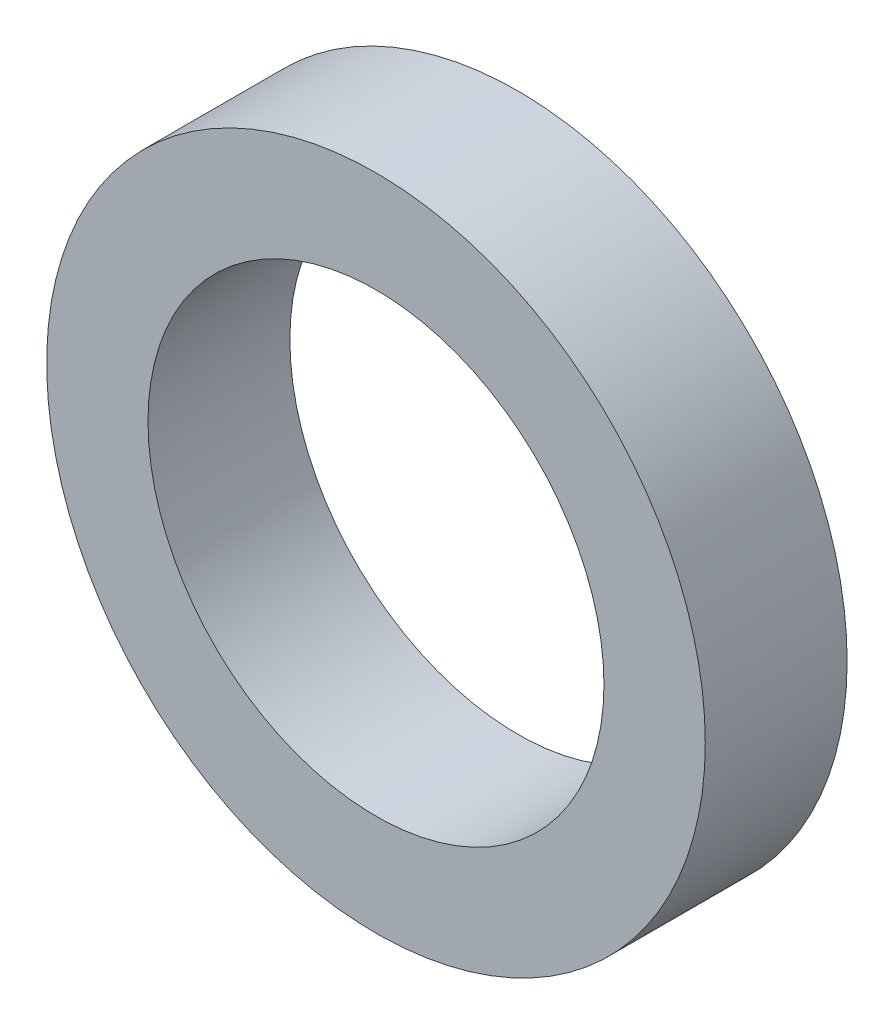
ISO-10303-21;
HEADER;
FILE_DESCRIPTION(('STEP AP214'),'2;1');
FILE_NAME('part.step','',(''),(''),'','','');
FILE_SCHEMA(('AUTOMOTIVE_DESIGN { 1 0 10303 214 1 1 1 1 }'));
ENDSEC;
DATA;
#1=APPLICATION_CONTEXT('core data for automotive mechanical design processes');
#2=APPLICATION_PROTOCOL_DEFINITION('international standard','automotive_design',2000,#1);
#3=PRODUCT_CONTEXT('',#1,'mechanical');
#4=PRODUCT('Part','Part','',(#3));
#5=PRODUCT_RELATED_PRODUCT_CATEGORY('part','',(#4));
#6=PRODUCT_DEFINITION_FORMATION('','',#4);
#7=PRODUCT_DEFINITION_CONTEXT('part definition',#1,'design');
#8=PRODUCT_DEFINITION('design','',#6,#7);
#9=PRODUCT_DEFINITION_SHAPE('','',#8);
#10=(LENGTH_UNIT() NAMED_UNIT(*) SI_UNIT(.MILLI.,.METRE.));
#11=(NAMED_UNIT(*) PLANE_ANGLE_UNIT() SI_UNIT($,.RADIAN.));
#12=(NAMED_UNIT(*) SI_UNIT($,.STERADIAN.) SOLID_ANGLE_UNIT());
#13=UNCERTAINTY_MEASURE_WITH_UNIT(LENGTH_MEASURE(1.E-05),#10,'distance_accuracy_value','');
#14=(GEOMETRIC_REPRESENTATION_CONTEXT(3) GLOBAL_UNCERTAINTY_ASSIGNED_CONTEXT((#13)) GLOBAL_UNIT_ASSIGNED_CONTEXT((#10,
#11,#12)) REPRESENTATION_CONTEXT('',''));
#15=CARTESIAN_POINT('',(0.,0.,0.));
#16=DIRECTION('',(0.,0.,1.));
#17=DIRECTION('',(1.,0.,0.));
#18=AXIS2_PLACEMENT_3D('',#15,#16,#17);
#19=CARTESIAN_POINT('',(0.,0.,14.));
#20=DIRECTION('',(0.,0.,1.));
#21=DIRECTION('',(1.,0.,0.));
#22=AXIS2_PLACEMENT_3D('',#19,#20,#21);
#23=PLANE('',#22);
#24=CARTESIAN_POINT('',(0.,0.,14.));
#25=DIRECTION('',(0.,0.,1.));
#26=DIRECTION('',(1.,0.,0.));
#27=AXIS2_PLACEMENT_3D('',#24,#25,#26);
#28=CIRCLE('',#27,32.5);
#29=CARTESIAN_POINT('',(32.5,0.,14.));
#30=VERTEX_POINT('',#29);
#31=EDGE_CURVE('E10',#30,#30,#28,.T.);
#32=ORIENTED_EDGE('',*,*,#31,.T.);
#33=EDGE_LOOP('',(#32));
#34=FACE_BOUND('',#33,.T.);
#35=CARTESIAN_POINT('',(0.,0.,14.));
#36=DIRECTION('',(0.,0.,1.));
#37=DIRECTION('',(1.,0.,0.));
#38=AXIS2_PLACEMENT_3D('',#35,#36,#37);
#39=CIRCLE('',#38,22.5);
#40=CARTESIAN_POINT('',(22.5,0.,14.));
#41=VERTEX_POINT('',#40);
#42=EDGE_CURVE('E57',#41,#41,#39,.T.);
#43=ORIENTED_EDGE('',*,*,#42,.F.);
#44=EDGE_LOOP('',(#43));
#45=FACE_BOUND('',#44,.T.);
#46=ADVANCED_FACE('F43',(#34,#45),#23,.T.);
#47=CARTESIAN_POINT('',(0.,0.,0.));
#48=DIRECTION('',(0.,0.,1.));
#49=DIRECTION('',(1.,0.,0.));
#50=AXIS2_PLACEMENT_3D('',#47,#48,#49);
#51=PLANE('',#50);
#52=CARTESIAN_POINT('',(0.,0.,0.));
#53=DIRECTION('',(0.,0.,1.));
#54=DIRECTION('',(1.,0.,0.));
#55=AXIS2_PLACEMENT_3D('',#52,#53,#54);
#56=CIRCLE('',#55,32.5);
#57=CARTESIAN_POINT('',(32.5,0.,0.));
#58=VERTEX_POINT('',#57);
#59=EDGE_CURVE('E50',#58,#58,#56,.T.);
#60=ORIENTED_EDGE('',*,*,#59,.F.);
#61=EDGE_LOOP('',(#60));
#62=FACE_BOUND('',#61,.T.);
#63=CARTESIAN_POINT('',(0.,0.,0.));
#64=DIRECTION('',(0.,0.,1.));
#65=DIRECTION('',(1.,0.,0.));
#66=AXIS2_PLACEMENT_3D('',#63,#64,#65);
#67=CIRCLE('',#66,22.5);
#68=CARTESIAN_POINT('',(22.5,0.,0.));
#69=VERTEX_POINT('',#68);
#70=EDGE_CURVE('E59',#69,#69,#67,.T.);
#71=ORIENTED_EDGE('',*,*,#70,.T.);
#72=EDGE_LOOP('',(#71));
#73=FACE_BOUND('',#72,.T.);
#74=ADVANCED_FACE('F68',(#62,#73),#51,.F.);
#75=CARTESIAN_POINT('',(0.,0.,14.));
#76=DIRECTION('',(0.,0.,-1.));
#77=DIRECTION('',(-1.,0.,0.));
#78=AXIS2_PLACEMENT_3D('',#75,#76,#77);
#79=CYLINDRICAL_SURFACE('',#78,32.5);
#80=ORIENTED_EDGE('',*,*,#31,.F.);
#81=EDGE_LOOP('',(#80));
#82=FACE_BOUND('',#81,.T.);
#83=ORIENTED_EDGE('',*,*,#59,.T.);
#84=EDGE_LOOP('',(#83));
#85=FACE_BOUND('',#84,.T.);
#86=ADVANCED_FACE('F44',(#82,#85),#79,.T.);
#87=CARTESIAN_POINT('',(0.,0.,14.));
#88=DIRECTION('',(0.,0.,-1.));
#89=DIRECTION('',(-1.,0.,0.));
#90=AXIS2_PLACEMENT_3D('',#87,#88,#89);
#91=CYLINDRICAL_SURFACE('',#90,22.5);
#92=ORIENTED_EDGE('',*,*,#42,.T.);
#93=EDGE_LOOP('',(#92));
#94=FACE_BOUND('',#93,.T.);
#95=ORIENTED_EDGE('',*,*,#70,.F.);
#96=EDGE_LOOP('',(#95));
#97=FACE_BOUND('',#96,.T.);
#98=ADVANCED_FACE('F67',(#94,#97),#91,.F.);
#99=CLOSED_SHELL('',(#46,#74,#86,#98));
#100=MANIFOLD_SOLID_BREP('B2',#99);
#101=ADVANCED_BREP_SHAPE_REPRESENTATION('',(#18,#100),#14);
#102=SHAPE_DEFINITION_REPRESENTATION(#9,#101);
ENDSEC;
END-ISO-10303-21;
